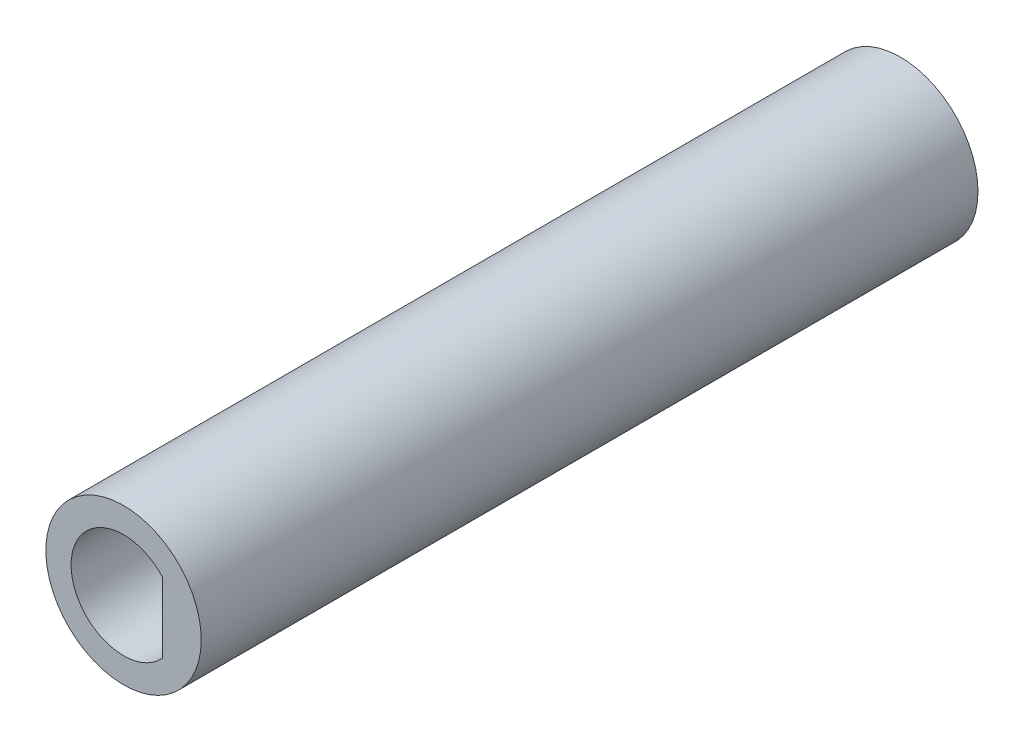
ISO-10303-21;
HEADER;
FILE_DESCRIPTION(('STEP AP214'),'2;1');
FILE_NAME('part.step','',(''),(''),'','','');
FILE_SCHEMA(('AUTOMOTIVE_DESIGN { 1 0 10303 214 1 1 1 1 }'));
ENDSEC;
DATA;
#1=APPLICATION_CONTEXT('core data for automotive mechanical design processes');
#2=APPLICATION_PROTOCOL_DEFINITION('international standard','automotive_design',2000,#1);
#3=PRODUCT_CONTEXT('',#1,'mechanical');
#4=PRODUCT('Part','Part','',(#3));
#5=PRODUCT_RELATED_PRODUCT_CATEGORY('part','',(#4));
#6=PRODUCT_DEFINITION_FORMATION('','',#4);
#7=PRODUCT_DEFINITION_CONTEXT('part definition',#1,'design');
#8=PRODUCT_DEFINITION('design','',#6,#7);
#9=PRODUCT_DEFINITION_SHAPE('','',#8);
#10=(LENGTH_UNIT() NAMED_UNIT(*) SI_UNIT(.MILLI.,.METRE.));
#11=(NAMED_UNIT(*) PLANE_ANGLE_UNIT() SI_UNIT($,.RADIAN.));
#12=(NAMED_UNIT(*) SI_UNIT($,.STERADIAN.) SOLID_ANGLE_UNIT());
#13=UNCERTAINTY_MEASURE_WITH_UNIT(LENGTH_MEASURE(1.E-05),#10,'distance_accuracy_value','');
#14=(GEOMETRIC_REPRESENTATION_CONTEXT(3) GLOBAL_UNCERTAINTY_ASSIGNED_CONTEXT((#13)) GLOBAL_UNIT_ASSIGNED_CONTEXT((#10,
#11,#12)) REPRESENTATION_CONTEXT('',''));
#15=CARTESIAN_POINT('',(0.,0.,0.));
#16=DIRECTION('',(0.,0.,1.));
#17=DIRECTION('',(1.,0.,0.));
#18=AXIS2_PLACEMENT_3D('',#15,#16,#17);
#19=CARTESIAN_POINT('',(0.,0.,15.));
#20=DIRECTION('',(0.,0.,1.));
#21=DIRECTION('',(1.,0.,0.));
#22=AXIS2_PLACEMENT_3D('',#19,#20,#21);
#23=PLANE('',#22);
#24=CARTESIAN_POINT('',(0.,0.,15.));
#25=DIRECTION('',(0.,0.,1.));
#26=DIRECTION('',(1.,0.,0.));
#27=AXIS2_PLACEMENT_3D('',#24,#25,#26);
#28=CIRCLE('',#27,6.);
#29=CARTESIAN_POINT('',(6.,0.,15.));
#30=VERTEX_POINT('',#29);
#31=EDGE_CURVE('E11',#30,#30,#28,.T.);
#32=ORIENTED_EDGE('',*,*,#31,.T.);
#33=EDGE_LOOP('',(#32));
#34=FACE_BOUND('',#33,.T.);
#35=DIRECTION('',(0.,1.,0.));
#36=VECTOR('',#35,1.);
#37=CARTESIAN_POINT('',(3.,2.72075357208256,15.));
#38=LINE('',#37,#36);
#39=CARTESIAN_POINT('',(3.,-2.72075357208256,15.));
#40=VERTEX_POINT('',#39);
#41=CARTESIAN_POINT('',(3.,2.72075357208256,15.));
#42=VERTEX_POINT('',#41);
#43=EDGE_CURVE('E64',#40,#42,#38,.T.);
#44=ORIENTED_EDGE('',*,*,#43,.F.);
#45=CARTESIAN_POINT('',(0.,0.,15.));
#46=DIRECTION('',(0.,0.,1.));
#47=DIRECTION('',(1.,0.,0.));
#48=AXIS2_PLACEMENT_3D('',#45,#46,#47);
#49=CIRCLE('',#48,4.05);
#50=EDGE_CURVE('E86',#42,#40,#49,.T.);
#51=ORIENTED_EDGE('',*,*,#50,.F.);
#52=EDGE_LOOP('',(#44,#51));
#53=FACE_BOUND('',#52,.T.);
#54=ADVANCED_FACE('F43',(#34,#53),#23,.T.);
#55=CARTESIAN_POINT('',(0.,0.,15.));
#56=DIRECTION('',(0.,0.,-1.));
#57=DIRECTION('',(-1.,0.,0.));
#58=AXIS2_PLACEMENT_3D('',#55,#56,#57);
#59=CYLINDRICAL_SURFACE('',#58,6.);
#60=ORIENTED_EDGE('',*,*,#31,.F.);
#61=EDGE_LOOP('',(#60));
#62=FACE_BOUND('',#61,.T.);
#63=CARTESIAN_POINT('',(0.,0.,-45.));
#64=DIRECTION('',(0.,0.,1.));
#65=DIRECTION('',(1.,0.,0.));
#66=AXIS2_PLACEMENT_3D('',#63,#64,#65);
#67=CIRCLE('',#66,6.);
#68=CARTESIAN_POINT('',(6.,0.,-45.));
#69=VERTEX_POINT('',#68);
#70=EDGE_CURVE('E82',#69,#69,#67,.T.);
#71=ORIENTED_EDGE('',*,*,#70,.T.);
#72=EDGE_LOOP('',(#71));
#73=FACE_BOUND('',#72,.T.);
#74=ADVANCED_FACE('F45',(#62,#73),#59,.T.);
#75=CARTESIAN_POINT('',(0.,0.,15.));
#76=DIRECTION('',(0.,0.,-1.));
#77=DIRECTION('',(-1.,0.,0.));
#78=AXIS2_PLACEMENT_3D('',#75,#76,#77);
#79=CYLINDRICAL_SURFACE('',#78,4.05);
#80=CARTESIAN_POINT('',(0.,0.,0.));
#81=DIRECTION('',(0.,0.,1.));
#82=DIRECTION('',(1.,0.,0.));
#83=AXIS2_PLACEMENT_3D('',#80,#81,#82);
#84=CIRCLE('',#83,4.05);
#85=CARTESIAN_POINT('',(3.,2.72075357208256,0.));
#86=VERTEX_POINT('',#85);
#87=CARTESIAN_POINT('',(3.,-2.72075357208256,0.));
#88=VERTEX_POINT('',#87);
#89=EDGE_CURVE('E78',#86,#88,#84,.T.);
#90=ORIENTED_EDGE('',*,*,#89,.F.);
#91=DIRECTION('',(0.,0.,-1.));
#92=VECTOR('',#91,1.);
#93=CARTESIAN_POINT('',(3.,2.72075357208256,15.));
#94=LINE('',#93,#92);
#95=EDGE_CURVE('E68',#42,#86,#94,.T.);
#96=ORIENTED_EDGE('',*,*,#95,.F.);
#97=ORIENTED_EDGE('',*,*,#50,.T.);
#98=DIRECTION('',(0.,0.,-1.));
#99=VECTOR('',#98,1.);
#100=CARTESIAN_POINT('',(3.,-2.72075357208256,15.));
#101=LINE('',#100,#99);
#102=EDGE_CURVE('E52',#40,#88,#101,.T.);
#103=ORIENTED_EDGE('',*,*,#102,.T.);
#104=EDGE_LOOP('',(#90,#96,#97,#103));
#105=FACE_BOUND('',#104,.T.);
#106=ADVANCED_FACE('F79',(#105),#79,.F.);
#107=CARTESIAN_POINT('',(3.,2.72075357208256,15.));
#108=DIRECTION('',(-1.,0.,0.));
#109=DIRECTION('',(0.,0.,1.));
#110=AXIS2_PLACEMENT_3D('',#107,#108,#109);
#111=PLANE('',#110);
#112=DIRECTION('',(0.,1.,0.));
#113=VECTOR('',#112,1.);
#114=CARTESIAN_POINT('',(3.,2.72075357208256,0.));
#115=LINE('',#114,#113);
#116=EDGE_CURVE('E72',#88,#86,#115,.T.);
#117=ORIENTED_EDGE('',*,*,#116,.F.);
#118=ORIENTED_EDGE('',*,*,#102,.F.);
#119=ORIENTED_EDGE('',*,*,#43,.T.);
#120=ORIENTED_EDGE('',*,*,#95,.T.);
#121=EDGE_LOOP('',(#117,#118,#119,#120));
#122=FACE_BOUND('',#121,.T.);
#123=ADVANCED_FACE('F70',(#122),#111,.T.);
#124=CARTESIAN_POINT('',(0.,0.,0.));
#125=DIRECTION('',(0.,0.,1.));
#126=DIRECTION('',(1.,0.,0.));
#127=AXIS2_PLACEMENT_3D('',#124,#125,#126);
#128=PLANE('',#127);
#129=ORIENTED_EDGE('',*,*,#116,.T.);
#130=ORIENTED_EDGE('',*,*,#89,.T.);
#131=EDGE_LOOP('',(#129,#130));
#132=FACE_BOUND('',#131,.T.);
#133=ADVANCED_FACE('F84',(#132),#128,.T.);
#134=CARTESIAN_POINT('',(0.,0.,-45.));
#135=DIRECTION('',(0.,0.,1.));
#136=DIRECTION('',(1.,0.,0.));
#137=AXIS2_PLACEMENT_3D('',#134,#135,#136);
#138=PLANE('',#137);
#139=ORIENTED_EDGE('',*,*,#70,.F.);
#140=EDGE_LOOP('',(#139));
#141=FACE_BOUND('',#140,.T.);
#142=ADVANCED_FACE('F99',(#141),#138,.F.);
#143=CLOSED_SHELL('',(#54,#74,#106,#123,#133,#142));
#144=MANIFOLD_SOLID_BREP('B2',#143);
#145=ADVANCED_BREP_SHAPE_REPRESENTATION('',(#18,#144),#14);
#146=SHAPE_DEFINITION_REPRESENTATION(#9,#145);
ENDSEC;
END-ISO-10303-21;
